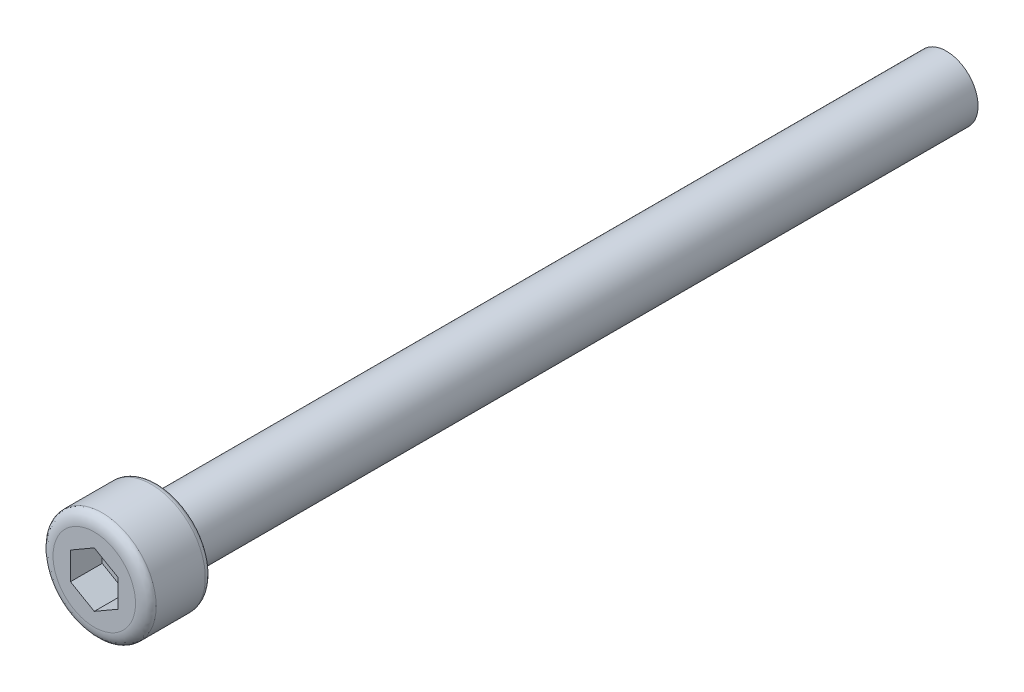
ISO-10303-21;
HEADER;
FILE_DESCRIPTION(('STEP AP214'),'2;1');
FILE_NAME('part.step','',(''),(''),'','','');
FILE_SCHEMA(('AUTOMOTIVE_DESIGN { 1 0 10303 214 1 1 1 1 }'));
ENDSEC;
DATA;
#1=APPLICATION_CONTEXT('core data for automotive mechanical design processes');
#2=APPLICATION_PROTOCOL_DEFINITION('international standard','automotive_design',2000,#1);
#3=PRODUCT_CONTEXT('',#1,'mechanical');
#4=PRODUCT('Part','Part','',(#3));
#5=PRODUCT_RELATED_PRODUCT_CATEGORY('part','',(#4));
#6=PRODUCT_DEFINITION_FORMATION('','',#4);
#7=PRODUCT_DEFINITION_CONTEXT('part definition',#1,'design');
#8=PRODUCT_DEFINITION('design','',#6,#7);
#9=PRODUCT_DEFINITION_SHAPE('','',#8);
#10=(LENGTH_UNIT() NAMED_UNIT(*) SI_UNIT(.MILLI.,.METRE.));
#11=(NAMED_UNIT(*) PLANE_ANGLE_UNIT() SI_UNIT($,.RADIAN.));
#12=(NAMED_UNIT(*) SI_UNIT($,.STERADIAN.) SOLID_ANGLE_UNIT());
#13=UNCERTAINTY_MEASURE_WITH_UNIT(LENGTH_MEASURE(1.E-05),#10,'distance_accuracy_value','');
#14=(GEOMETRIC_REPRESENTATION_CONTEXT(3) GLOBAL_UNCERTAINTY_ASSIGNED_CONTEXT((#13)) GLOBAL_UNIT_ASSIGNED_CONTEXT((#10,
#11,#12)) REPRESENTATION_CONTEXT('',''));
#15=CARTESIAN_POINT('',(0.,0.,0.));
#16=DIRECTION('',(0.,0.,1.));
#17=DIRECTION('',(1.,0.,0.));
#18=AXIS2_PLACEMENT_3D('',#15,#16,#17);
#19=CARTESIAN_POINT('',(0.,0.,27.));
#20=DIRECTION('',(0.,0.,1.));
#21=DIRECTION('',(1.,0.,0.));
#22=AXIS2_PLACEMENT_3D('',#19,#20,#21);
#23=PLANE('',#22);
#24=DIRECTION('',(-0.866025403784439,0.5,0.));
#25=VECTOR('',#24,1.);
#26=CARTESIAN_POINT('',(1.5,0.86602540378444,27.));
#27=LINE('',#26,#25);
#28=CARTESIAN_POINT('',(1.5,0.86602540378444,27.));
#29=VERTEX_POINT('',#28);
#30=CARTESIAN_POINT('',(0.,1.73205080756888,27.));
#31=VERTEX_POINT('',#30);
#32=EDGE_CURVE('E61',#29,#31,#27,.T.);
#33=ORIENTED_EDGE('',*,*,#32,.F.);
#34=DIRECTION('',(0.,1.,0.));
#35=VECTOR('',#34,1.);
#36=CARTESIAN_POINT('',(1.5,-0.866025403784439,27.));
#37=LINE('',#36,#35);
#38=CARTESIAN_POINT('',(1.5,-0.866025403784439,27.));
#39=VERTEX_POINT('',#38);
#40=EDGE_CURVE('E144',#39,#29,#37,.T.);
#41=ORIENTED_EDGE('',*,*,#40,.F.);
#42=DIRECTION('',(0.866025403784439,0.5,0.));
#43=VECTOR('',#42,1.);
#44=CARTESIAN_POINT('',(0.,-1.73205080756888,27.));
#45=LINE('',#44,#43);
#46=CARTESIAN_POINT('',(0.,-1.73205080756888,27.));
#47=VERTEX_POINT('',#46);
#48=EDGE_CURVE('E142',#47,#39,#45,.T.);
#49=ORIENTED_EDGE('',*,*,#48,.F.);
#50=DIRECTION('',(0.866025403784438,-0.5,0.));
#51=VECTOR('',#50,1.);
#52=CARTESIAN_POINT('',(-1.5,-0.866025403784438,27.));
#53=LINE('',#52,#51);
#54=CARTESIAN_POINT('',(-1.5,-0.866025403784438,27.));
#55=VERTEX_POINT('',#54);
#56=EDGE_CURVE('E109',#55,#47,#53,.T.);
#57=ORIENTED_EDGE('',*,*,#56,.F.);
#58=DIRECTION('',(0.,-1.,0.));
#59=VECTOR('',#58,1.);
#60=CARTESIAN_POINT('',(-1.5,0.866025403784439,27.));
#61=LINE('',#60,#59);
#62=CARTESIAN_POINT('',(-1.5,0.866025403784439,27.));
#63=VERTEX_POINT('',#62);
#64=EDGE_CURVE('E138',#63,#55,#61,.T.);
#65=ORIENTED_EDGE('',*,*,#64,.F.);
#66=DIRECTION('',(-0.866025403784439,-0.5,0.));
#67=VECTOR('',#66,1.);
#68=CARTESIAN_POINT('',(0.,1.73205080756888,27.));
#69=LINE('',#68,#67);
#70=EDGE_CURVE('E135',#31,#63,#69,.T.);
#71=ORIENTED_EDGE('',*,*,#70,.F.);
#72=EDGE_LOOP('',(#33,#41,#49,#57,#65,#71));
#73=FACE_BOUND('',#72,.T.);
#74=CARTESIAN_POINT('',(-2.6,0.,27.));
#75=CARTESIAN_POINT('',(-2.6,0.340339195747883,27.));
#76=CARTESIAN_POINT('',(-2.53232895612646,0.680544507086415,27.));
#77=CARTESIAN_POINT('',(-2.27184461293223,1.30940934121205,27.));
#78=CARTESIAN_POINT('',(-2.07913378430194,1.5978214778681,27.));
#79=CARTESIAN_POINT('',(-1.59782147786811,2.07913378430193,27.));
#80=CARTESIAN_POINT('',(-1.30940934121206,2.27184461293215,27.));
#81=CARTESIAN_POINT('',(-0.680544507086416,2.53232895612653,27.));
#82=CARTESIAN_POINT('',(-0.340339195747889,2.6,27.));
#83=CARTESIAN_POINT('',(0.340339195747889,2.6,27.));
#84=CARTESIAN_POINT('',(0.680544507086414,2.53232895612653,27.));
#85=CARTESIAN_POINT('',(1.30940934121205,2.27184461293216,27.));
#86=CARTESIAN_POINT('',(1.5978214778681,2.07913378430191,27.));
#87=CARTESIAN_POINT('',(2.07913378430195,1.59782147786813,27.));
#88=CARTESIAN_POINT('',(2.27184461293222,1.30940934121206,27.));
#89=CARTESIAN_POINT('',(2.53232895612648,0.6805445070864,27.));
#90=CARTESIAN_POINT('',(2.6,0.340339195748109,27.));
#91=CARTESIAN_POINT('',(2.6,-0.340339195748121,27.));
#92=CARTESIAN_POINT('',(2.5323289561267,-0.680544507086153,27.));
#93=CARTESIAN_POINT('',(2.27184461293199,-1.30940934121233,27.));
#94=CARTESIAN_POINT('',(2.0791337843018,-1.59782147786829,27.));
#95=CARTESIAN_POINT('',(1.59782147786825,-2.07913378430177,27.));
#96=CARTESIAN_POINT('',(1.30940934121224,-2.27184461293217,27.));
#97=CARTESIAN_POINT('',(0.680544507086231,-2.53232895612654,27.));
#98=CARTESIAN_POINT('',(0.340339195748087,-2.60000000000001,27.));
#99=CARTESIAN_POINT('',(-0.340339195748083,-2.60000000000001,27.));
#100=CARTESIAN_POINT('',(-0.680544507086234,-2.53232895612669,27.));
#101=CARTESIAN_POINT('',(-1.30940934121224,-2.27184461293202,27.));
#102=CARTESIAN_POINT('',(-1.59782147786815,-2.07913378430195,27.));
#103=CARTESIAN_POINT('',(-2.0791337843019,-1.59782147786812,27.));
#104=CARTESIAN_POINT('',(-2.27184461293216,-1.30940934121205,27.));
#105=CARTESIAN_POINT('',(-2.53232895612654,-0.68054450708642,27.));
#106=CARTESIAN_POINT('',(-2.6,-0.340339195747894,27.));
#107=CARTESIAN_POINT('',(-2.6,0.,27.));
#108=(BOUNDED_CURVE() B_SPLINE_CURVE(3,(#74,#75,#76,#77,#78,#79,#80,#81,#82,#83,#84,#85,#86,#87,
#88,#89,#90,#91,#92,#93,#94,#95,#96,#97,#98,#99,#100,#101,#102,#103,#104,#105,#106,#107),
.UNSPECIFIED.,.T.,.F.) B_SPLINE_CURVE_WITH_KNOTS((4,2,2,2,2,2,2,2,2,2,2,2,2,2,2,2,4),
(-3.14159265358979,-2.74889357189107,-2.35619449019234,-1.96349540849362,-1.5707963267949,
-1.17809724509617,-0.785398163397448,-0.392699081698724,0.,0.392699081698724,0.785398163397448,
1.17809724509617,1.5707963267949,1.96349540849362,2.35619449019234,2.74889357189107,
3.14159265358979),
.UNSPECIFIED.) CURVE() GEOMETRIC_REPRESENTATION_ITEM() RATIONAL_B_SPLINE_CURVE((1.,1.,1.,1.,1.,
1.,1.,1.,1.,1.,1.,1.,1.,1.,1.,1.,1.,1.,1.,1.,1.,1.,1.,1.,1.,1.,1.,1.,1.,1.,1.,1.,1.,1.)) REPRESENTATION_ITEM(''));
#109=CARTESIAN_POINT('',(-2.6,0.,27.));
#110=VERTEX_POINT('',#109);
#111=EDGE_CURVE('E12',#110,#110,#108,.F.);
#112=ORIENTED_EDGE('',*,*,#111,.T.);
#113=EDGE_LOOP('',(#112));
#114=FACE_BOUND('',#113,.T.);
#115=ADVANCED_FACE('F40',(#73,#114),#23,.T.);
#116=CARTESIAN_POINT('',(0.,0.,-27.));
#117=DIRECTION('',(0.,0.,-1.));
#118=DIRECTION('',(-1.,0.,0.));
#119=AXIS2_PLACEMENT_3D('',#116,#117,#118);
#120=CYLINDRICAL_SURFACE('',#119,3.4);
#121=CARTESIAN_POINT('',(-3.4,0.,26.5));
#122=CARTESIAN_POINT('',(-3.4,-0.445058948285706,26.5));
#123=CARTESIAN_POINT('',(-3.31150709647315,-0.889942816959149,26.5));
#124=CARTESIAN_POINT('',(-2.97087372460361,-1.71230452312347,26.5));
#125=CARTESIAN_POINT('',(-2.71886725639482,-2.08945885567371,26.5));
#126=CARTESIAN_POINT('',(-2.0894588556737,-2.71886725639483,26.5));
#127=CARTESIAN_POINT('',(-1.71230452312375,-2.9708737246035,26.5));
#128=CARTESIAN_POINT('',(-0.889942816958871,-3.31150709647327,26.5));
#129=CARTESIAN_POINT('',(-0.445058948285955,-3.40000000000001,26.5));
#130=CARTESIAN_POINT('',(0.44505894828596,-3.40000000000001,26.5));
#131=CARTESIAN_POINT('',(0.889942816958919,-3.31150709647325,26.5));
#132=CARTESIAN_POINT('',(1.7123045231237,-2.97087372460352,26.5));
#133=CARTESIAN_POINT('',(2.08945885567389,-2.71886725639465,26.5));
#134=CARTESIAN_POINT('',(2.71886725639464,-2.08945885567389,26.5));
#135=CARTESIAN_POINT('',(2.97087372460347,-1.71230452312381,26.5));
#136=CARTESIAN_POINT('',(3.31150709647329,-0.889942816958812,26.5));
#137=CARTESIAN_POINT('',(3.4,-0.445058948286002,26.5));
#138=CARTESIAN_POINT('',(3.4,0.44505894828599,26.5));
#139=CARTESIAN_POINT('',(3.31150709647315,0.889942816959131,26.5));
#140=CARTESIAN_POINT('',(2.9708737246036,1.71230452312347,26.5));
#141=CARTESIAN_POINT('',(2.71886725639483,2.0894588556737,26.5));
#142=CARTESIAN_POINT('',(2.0894588556737,2.71886725639482,26.5));
#143=CARTESIAN_POINT('',(1.71230452312345,2.97087372460361,26.5));
#144=CARTESIAN_POINT('',(0.889942816959163,3.31150709647313,26.5));
#145=CARTESIAN_POINT('',(0.445058948285701,3.4,26.5));
#146=CARTESIAN_POINT('',(-0.4450589482857,3.4,26.5));
#147=CARTESIAN_POINT('',(-0.88994281695914,3.31150709647314,26.5));
#148=CARTESIAN_POINT('',(-1.71230452312348,2.9708737246036,26.5));
#149=CARTESIAN_POINT('',(-2.08945885567371,2.71886725639482,26.5));
#150=CARTESIAN_POINT('',(-2.71886725639482,2.0894588556737,26.5));
#151=CARTESIAN_POINT('',(-2.97087372460362,1.71230452312344,26.5));
#152=CARTESIAN_POINT('',(-3.31150709647313,0.889942816959173,26.5));
#153=CARTESIAN_POINT('',(-3.4,0.445058948285695,26.5));
#154=CARTESIAN_POINT('',(-3.4,0.,26.5));
#155=(BOUNDED_CURVE() B_SPLINE_CURVE(3,(#121,#122,#123,#124,#125,#126,#127,#128,#129,#130,#131,
#132,#133,#134,#135,#136,#137,#138,#139,#140,#141,#142,#143,#144,#145,#146,#147,#148,#149,#150,
#151,#152,#153,#154),.UNSPECIFIED.,.T.,.F.) B_SPLINE_CURVE_WITH_KNOTS((4,2,2,2,2,2,2,2,2,2,2,2,
2,2,2,2,4),(-3.14159265358979,-2.74889357189107,-2.35619449019234,-1.96349540849362,
-1.5707963267949,-1.17809724509617,-0.785398163397448,-0.392699081698724,0.,0.392699081698724,
0.785398163397448,1.17809724509617,1.5707963267949,1.96349540849362,2.35619449019234,
2.74889357189107,3.14159265358979),
.UNSPECIFIED.) CURVE() GEOMETRIC_REPRESENTATION_ITEM() RATIONAL_B_SPLINE_CURVE((1.,1.,1.,1.,1.,
1.,1.,1.,1.,1.,1.,1.,1.,1.,1.,1.,1.,1.,1.,1.,1.,1.,1.,1.,1.,1.,1.,1.,1.,1.,1.,1.,1.,1.)) REPRESENTATION_ITEM(''));
#156=CARTESIAN_POINT('',(-3.4,0.,26.5));
#157=VERTEX_POINT('',#156);
#158=EDGE_CURVE('E54',#157,#157,#155,.F.);
#159=ORIENTED_EDGE('',*,*,#158,.T.);
#160=EDGE_LOOP('',(#159));
#161=FACE_BOUND('',#160,.T.);
#162=CARTESIAN_POINT('',(0.,0.,23.4));
#163=DIRECTION('',(0.,0.,-1.));
#164=DIRECTION('',(-1.,0.,0.));
#165=AXIS2_PLACEMENT_3D('',#162,#163,#164);
#166=CIRCLE('',#165,3.4);
#167=CARTESIAN_POINT('',(-3.4,0.,23.4));
#168=VERTEX_POINT('',#167);
#169=EDGE_CURVE('E165',#168,#168,#166,.F.);
#170=ORIENTED_EDGE('',*,*,#169,.T.);
#171=EDGE_LOOP('',(#170));
#172=FACE_BOUND('',#171,.T.);
#173=ADVANCED_FACE('F177',(#161,#172),#120,.T.);
#174=CARTESIAN_POINT('',(0.,3.4,23.));
#175=DIRECTION('',(0.,0.,-1.));
#176=DIRECTION('',(-1.,0.,0.));
#177=AXIS2_PLACEMENT_3D('',#174,#175,#176);
#178=PLANE('',#177);
#179=CARTESIAN_POINT('',(0.,0.,23.));
#180=DIRECTION('',(0.,0.,-1.));
#181=DIRECTION('',(-1.,0.,0.));
#182=AXIS2_PLACEMENT_3D('',#179,#180,#181);
#183=CIRCLE('',#182,3.);
#184=CARTESIAN_POINT('',(-3.,0.,23.));
#185=VERTEX_POINT('',#184);
#186=EDGE_CURVE('E162',#185,#185,#183,.T.);
#187=ORIENTED_EDGE('',*,*,#186,.T.);
#188=EDGE_LOOP('',(#187));
#189=FACE_BOUND('',#188,.T.);
#190=CARTESIAN_POINT('',(0.,0.,23.));
#191=DIRECTION('',(0.,0.,-1.));
#192=DIRECTION('',(-1.,0.,0.));
#193=AXIS2_PLACEMENT_3D('',#190,#191,#192);
#194=CIRCLE('',#193,2.00000000000001);
#195=CARTESIAN_POINT('',(-2.00000000000001,0.,23.));
#196=VERTEX_POINT('',#195);
#197=EDGE_CURVE('E148',#196,#196,#194,.T.);
#198=ORIENTED_EDGE('',*,*,#197,.F.);
#199=EDGE_LOOP('',(#198));
#200=FACE_BOUND('',#199,.T.);
#201=ADVANCED_FACE('F187',(#189,#200),#178,.T.);
#202=CARTESIAN_POINT('',(0.,0.,-27.));
#203=DIRECTION('',(0.,0.,-1.));
#204=DIRECTION('',(-1.,0.,0.));
#205=AXIS2_PLACEMENT_3D('',#202,#203,#204);
#206=CYLINDRICAL_SURFACE('',#205,2.00000000000001);
#207=CARTESIAN_POINT('',(0.,0.,-26.7));
#208=DIRECTION('',(0.,0.,-1.));
#209=DIRECTION('',(-1.,0.,0.));
#210=AXIS2_PLACEMENT_3D('',#207,#208,#209);
#211=CIRCLE('',#210,2.00000000000001);
#212=CARTESIAN_POINT('',(-2.00000000000001,0.,-26.7));
#213=VERTEX_POINT('',#212);
#214=EDGE_CURVE('E159',#213,#213,#211,.F.);
#215=ORIENTED_EDGE('',*,*,#214,.T.);
#216=EDGE_LOOP('',(#215));
#217=FACE_BOUND('',#216,.T.);
#218=ORIENTED_EDGE('',*,*,#197,.T.);
#219=EDGE_LOOP('',(#218));
#220=FACE_BOUND('',#219,.T.);
#221=ADVANCED_FACE('F236',(#217,#220),#206,.T.);
#222=CARTESIAN_POINT('',(0.,2.,-27.));
#223=DIRECTION('',(0.,0.,-1.));
#224=DIRECTION('',(-1.,0.,0.));
#225=AXIS2_PLACEMENT_3D('',#222,#223,#224);
#226=PLANE('',#225);
#227=CARTESIAN_POINT('',(0.,0.,-27.));
#228=DIRECTION('',(0.,0.,-1.));
#229=DIRECTION('',(-1.,0.,0.));
#230=AXIS2_PLACEMENT_3D('',#227,#228,#229);
#231=CIRCLE('',#230,1.48038475772933);
#232=CARTESIAN_POINT('',(-1.48038475772933,0.,-27.));
#233=VERTEX_POINT('',#232);
#234=EDGE_CURVE('E156',#233,#233,#231,.T.);
#235=ORIENTED_EDGE('',*,*,#234,.T.);
#236=EDGE_LOOP('',(#235));
#237=FACE_BOUND('',#236,.T.);
#238=ADVANCED_FACE('F228',(#237),#226,.T.);
#239=CARTESIAN_POINT('',(0.,0.,-27.));
#240=DIRECTION('',(0.,0.,1.));
#241=DIRECTION('',(1.,0.,0.));
#242=AXIS2_PLACEMENT_3D('',#239,#240,#241);
#243=CONICAL_SURFACE('',#242,1.48038475772933,1.0471975511966);
#244=ORIENTED_EDGE('',*,*,#214,.F.);
#245=EDGE_LOOP('',(#244));
#246=FACE_BOUND('',#245,.T.);
#247=ORIENTED_EDGE('',*,*,#234,.F.);
#248=EDGE_LOOP('',(#247));
#249=FACE_BOUND('',#248,.T.);
#250=ADVANCED_FACE('F194',(#246,#249),#243,.T.);
#251=CARTESIAN_POINT('',(0.,0.,23.4));
#252=DIRECTION('',(0.,0.,-1.));
#253=DIRECTION('',(-1.,0.,0.));
#254=AXIS2_PLACEMENT_3D('',#251,#252,#253);
#255=TOROIDAL_SURFACE('',#254,3.,0.4);
#256=ORIENTED_EDGE('',*,*,#169,.F.);
#257=EDGE_LOOP('',(#256));
#258=FACE_BOUND('',#257,.T.);
#259=ORIENTED_EDGE('',*,*,#186,.F.);
#260=EDGE_LOOP('',(#259));
#261=FACE_BOUND('',#260,.T.);
#262=ADVANCED_FACE('F217',(#258,#261),#255,.T.);
#263=CARTESIAN_POINT('',(-2.6,0.,27.));
#264=CARTESIAN_POINT('',(-2.6,-0.340339195747894,27.));
#265=CARTESIAN_POINT('',(-2.53232895612654,-0.68054450708642,27.));
#266=CARTESIAN_POINT('',(-2.27184461293216,-1.30940934121205,27.));
#267=CARTESIAN_POINT('',(-2.0791337843019,-1.59782147786812,27.));
#268=CARTESIAN_POINT('',(-1.59782147786815,-2.07913378430195,27.));
#269=CARTESIAN_POINT('',(-1.30940934121224,-2.27184461293202,27.));
#270=CARTESIAN_POINT('',(-0.680544507086234,-2.53232895612669,27.));
#271=CARTESIAN_POINT('',(-0.340339195748083,-2.60000000000001,27.));
#272=CARTESIAN_POINT('',(0.340339195748087,-2.60000000000001,27.));
#273=CARTESIAN_POINT('',(0.680544507086231,-2.53232895612654,27.));
#274=CARTESIAN_POINT('',(1.30940934121224,-2.27184461293217,27.));
#275=CARTESIAN_POINT('',(1.59782147786825,-2.07913378430177,27.));
#276=CARTESIAN_POINT('',(2.0791337843018,-1.59782147786829,27.));
#277=CARTESIAN_POINT('',(2.27184461293199,-1.30940934121233,27.));
#278=CARTESIAN_POINT('',(2.5323289561267,-0.680544507086153,27.));
#279=CARTESIAN_POINT('',(2.6,-0.340339195748121,27.));
#280=CARTESIAN_POINT('',(2.6,0.340339195748109,27.));
#281=CARTESIAN_POINT('',(2.53232895612648,0.6805445070864,27.));
#282=CARTESIAN_POINT('',(2.27184461293222,1.30940934121206,27.));
#283=CARTESIAN_POINT('',(2.07913378430195,1.59782147786813,27.));
#284=CARTESIAN_POINT('',(1.5978214778681,2.07913378430191,27.));
#285=CARTESIAN_POINT('',(1.30940934121205,2.27184461293216,27.));
#286=CARTESIAN_POINT('',(0.680544507086414,2.53232895612653,27.));
#287=CARTESIAN_POINT('',(0.340339195747889,2.6,27.));
#288=CARTESIAN_POINT('',(-0.340339195747889,2.6,27.));
#289=CARTESIAN_POINT('',(-0.680544507086416,2.53232895612653,27.));
#290=CARTESIAN_POINT('',(-1.30940934121206,2.27184461293215,27.));
#291=CARTESIAN_POINT('',(-1.59782147786811,2.07913378430193,27.));
#292=CARTESIAN_POINT('',(-2.07913378430194,1.5978214778681,27.));
#293=CARTESIAN_POINT('',(-2.27184461293223,1.30940934121205,27.));
#294=CARTESIAN_POINT('',(-2.53232895612646,0.680544507086415,27.));
#295=CARTESIAN_POINT('',(-2.6,0.340339195747883,27.));
#296=CARTESIAN_POINT('',(-2.6,0.,27.));
#297=CARTESIAN_POINT('',(-3.4,0.,27.));
#298=CARTESIAN_POINT('',(-3.4,-0.445058948285706,27.));
#299=CARTESIAN_POINT('',(-3.31150709647319,-0.889942816959165,27.));
#300=CARTESIAN_POINT('',(-2.97087372460357,-1.71230452312345,27.));
#301=CARTESIAN_POINT('',(-2.71886725639478,-2.08945885567368,27.));
#302=CARTESIAN_POINT('',(-2.08945885567374,-2.71886725639487,27.));
#303=CARTESIAN_POINT('',(-1.71230452312373,-2.97087372460345,27.));
#304=CARTESIAN_POINT('',(-0.88994281695889,-3.31150709647331,27.));
#305=CARTESIAN_POINT('',(-0.445058948285955,-3.40000000000001,27.));
#306=CARTESIAN_POINT('',(0.44505894828596,-3.40000000000001,27.));
#307=CARTESIAN_POINT('',(0.889942816958886,-3.31150709647317,27.));
#308=CARTESIAN_POINT('',(1.71230452312373,-2.9708737246036,27.));
#309=CARTESIAN_POINT('',(2.08945885567385,-2.71886725639461,27.));
#310=CARTESIAN_POINT('',(2.71886725639468,-2.08945885567393,27.));
#311=CARTESIAN_POINT('',(2.97087372460342,-1.71230452312379,27.));
#312=CARTESIAN_POINT('',(3.31150709647333,-0.889942816958831,27.));
#313=CARTESIAN_POINT('',(3.4,-0.445058948286002,27.));
#314=CARTESIAN_POINT('',(3.4,0.44505894828599,27.));
#315=CARTESIAN_POINT('',(3.31150709647311,0.889942816959115,27.));
#316=CARTESIAN_POINT('',(2.97087372460364,1.71230452312349,27.));
#317=CARTESIAN_POINT('',(2.71886725639483,2.08945885567362,27.));
#318=CARTESIAN_POINT('',(2.0894588556737,2.71886725639489,27.));
#319=CARTESIAN_POINT('',(1.71230452312347,2.97087372460366,27.));
#320=CARTESIAN_POINT('',(0.889942816959142,3.31150709647308,27.));
#321=CARTESIAN_POINT('',(0.445058948285701,3.4,27.));
#322=CARTESIAN_POINT('',(-0.4450589482857,3.4,27.));
#323=CARTESIAN_POINT('',(-0.889942816959144,3.31150709647315,27.));
#324=CARTESIAN_POINT('',(-1.71230452312347,2.97087372460359,27.));
#325=CARTESIAN_POINT('',(-2.08945885567374,2.71886725639485,27.));
#326=CARTESIAN_POINT('',(-2.71886725639479,2.08945885567366,27.));
#327=CARTESIAN_POINT('',(-2.97087372460364,1.71230452312345,27.));
#328=CARTESIAN_POINT('',(-3.31150709647311,0.889942816959163,27.));
#329=CARTESIAN_POINT('',(-3.4,0.445058948285695,27.));
#330=CARTESIAN_POINT('',(-3.4,0.,27.));
#331=CARTESIAN_POINT('',(-3.4,0.,26.5));
#332=CARTESIAN_POINT('',(-3.4,-0.445058948285706,26.5));
#333=CARTESIAN_POINT('',(-3.31150709647315,-0.889942816959149,26.5));
#334=CARTESIAN_POINT('',(-2.97087372460361,-1.71230452312347,26.5));
#335=CARTESIAN_POINT('',(-2.71886725639482,-2.08945885567371,26.5));
#336=CARTESIAN_POINT('',(-2.0894588556737,-2.71886725639483,26.5));
#337=CARTESIAN_POINT('',(-1.71230452312375,-2.9708737246035,26.5));
#338=CARTESIAN_POINT('',(-0.889942816958871,-3.31150709647327,26.5));
#339=CARTESIAN_POINT('',(-0.445058948285955,-3.40000000000001,26.5));
#340=CARTESIAN_POINT('',(0.44505894828596,-3.40000000000001,26.5));
#341=CARTESIAN_POINT('',(0.889942816958919,-3.31150709647325,26.5));
#342=CARTESIAN_POINT('',(1.7123045231237,-2.97087372460352,26.5));
#343=CARTESIAN_POINT('',(2.08945885567389,-2.71886725639465,26.5));
#344=CARTESIAN_POINT('',(2.71886725639464,-2.08945885567389,26.5));
#345=CARTESIAN_POINT('',(2.97087372460347,-1.71230452312381,26.5));
#346=CARTESIAN_POINT('',(3.31150709647329,-0.889942816958812,26.5));
#347=CARTESIAN_POINT('',(3.4,-0.445058948286002,26.5));
#348=CARTESIAN_POINT('',(3.4,0.44505894828599,26.5));
#349=CARTESIAN_POINT('',(3.31150709647315,0.889942816959131,26.5));
#350=CARTESIAN_POINT('',(2.9708737246036,1.71230452312347,26.5));
#351=CARTESIAN_POINT('',(2.71886725639483,2.0894588556737,26.5));
#352=CARTESIAN_POINT('',(2.0894588556737,2.71886725639482,26.5));
#353=CARTESIAN_POINT('',(1.71230452312345,2.97087372460361,26.5));
#354=CARTESIAN_POINT('',(0.889942816959163,3.31150709647313,26.5));
#355=CARTESIAN_POINT('',(0.445058948285701,3.4,26.5));
#356=CARTESIAN_POINT('',(-0.4450589482857,3.4,26.5));
#357=CARTESIAN_POINT('',(-0.88994281695914,3.31150709647314,26.5));
#358=CARTESIAN_POINT('',(-1.71230452312348,2.9708737246036,26.5));
#359=CARTESIAN_POINT('',(-2.08945885567371,2.71886725639482,26.5));
#360=CARTESIAN_POINT('',(-2.71886725639482,2.0894588556737,26.5));
#361=CARTESIAN_POINT('',(-2.97087372460362,1.71230452312344,26.5));
#362=CARTESIAN_POINT('',(-3.31150709647313,0.889942816959173,26.5));
#363=CARTESIAN_POINT('',(-3.4,0.445058948285695,26.5));
#364=CARTESIAN_POINT('',(-3.4,0.,26.5));
#365=(BOUNDED_SURFACE() B_SPLINE_SURFACE(2,3,((#263,#264,#265,#266,#267,#268,#269,#270,#271,
#272,#273,#274,#275,#276,#277,#278,#279,#280,#281,#282,#283,#284,#285,#286,#287,#288,#289,#290,
#291,#292,#293,#294,#295,#296),(#297,#298,#299,#300,#301,#302,#303,#304,#305,#306,#307,#308,
#309,#310,#311,#312,#313,#314,#315,#316,#317,#318,#319,#320,#321,#322,#323,#324,#325,#326,#327,
#328,#329,#330),(#331,#332,#333,#334,#335,#336,#337,#338,#339,#340,#341,#342,#343,#344,#345,
#346,#347,#348,#349,#350,#351,#352,#353,#354,#355,#356,#357,#358,#359,#360,#361,#362,#363,
#364)),.UNSPECIFIED.,.F.,.T.,.F.) B_SPLINE_SURFACE_WITH_KNOTS((3,3),(4,2,2,2,2,2,2,2,2,2,2,2,2,
2,2,2,4),(0.,1.),(-3.14159265358979,-2.74889357189107,-2.35619449019234,-1.96349540849362,
-1.5707963267949,-1.17809724509617,-0.785398163397448,-0.392699081698724,0.,0.392699081698724,
0.785398163397448,1.17809724509617,1.5707963267949,1.96349540849362,2.35619449019234,
2.74889357189107,3.14159265358979),
.UNSPECIFIED.) GEOMETRIC_REPRESENTATION_ITEM() RATIONAL_B_SPLINE_SURFACE(((1.,1.,1.,1.,1.,1.,1.,
1.,1.,1.,1.,1.,1.,1.,1.,1.,1.,1.,1.,1.,1.,1.,1.,1.,1.,1.,1.,1.,1.,1.,1.,1.,1.,1.),
(0.707106781186548,0.707106781186548,0.707106781186548,0.707106781186548,0.707106781186548,
0.707106781186548,0.707106781186548,0.707106781186548,0.707106781186548,0.707106781186548,
0.707106781186548,0.707106781186548,0.707106781186548,0.707106781186548,0.707106781186548,
0.707106781186548,0.707106781186548,0.707106781186548,0.707106781186548,0.707106781186548,
0.707106781186548,0.707106781186548,0.707106781186548,0.707106781186548,0.707106781186548,
0.707106781186548,0.707106781186548,0.707106781186548,0.707106781186548,0.707106781186548,
0.707106781186548,0.707106781186548,0.707106781186548,0.707106781186548),(1.,1.,1.,1.,1.,1.,1.,
1.,1.,1.,1.,1.,1.,1.,1.,1.,1.,1.,1.,1.,1.,1.,1.,1.,1.,1.,1.,1.,1.,1.,1.,1.,1.,1.))) REPRESENTATION_ITEM('') SURFACE());
#366=ORIENTED_EDGE('',*,*,#111,.F.);
#367=EDGE_LOOP('',(#366));
#368=FACE_BOUND('',#367,.T.);
#369=ORIENTED_EDGE('',*,*,#158,.F.);
#370=EDGE_LOOP('',(#369));
#371=FACE_BOUND('',#370,.T.);
#372=ADVANCED_FACE('F43',(#368,#371),#365,.T.);
#373=CARTESIAN_POINT('',(1.5,0.86602540378444,25.));
#374=DIRECTION('',(0.5,0.866025403784439,0.));
#375=DIRECTION('',(-0.866025403784439,0.5,0.));
#376=AXIS2_PLACEMENT_3D('',#373,#374,#375);
#377=PLANE('',#376);
#378=ORIENTED_EDGE('',*,*,#32,.T.);
#379=DIRECTION('',(0.,0.,1.));
#380=VECTOR('',#379,1.);
#381=CARTESIAN_POINT('',(0.,1.73205080756888,25.));
#382=LINE('',#381,#380);
#383=CARTESIAN_POINT('',(0.,1.73205080756888,25.));
#384=VERTEX_POINT('',#383);
#385=EDGE_CURVE('E91',#384,#31,#382,.T.);
#386=ORIENTED_EDGE('',*,*,#385,.F.);
#387=DIRECTION('',(-0.866025403784439,0.5,0.));
#388=VECTOR('',#387,1.);
#389=CARTESIAN_POINT('',(1.5,0.86602540378444,25.));
#390=LINE('',#389,#388);
#391=CARTESIAN_POINT('',(1.5,0.86602540378444,25.));
#392=VERTEX_POINT('',#391);
#393=EDGE_CURVE('E146',#392,#384,#390,.T.);
#394=ORIENTED_EDGE('',*,*,#393,.F.);
#395=DIRECTION('',(0.,0.,1.));
#396=VECTOR('',#395,1.);
#397=CARTESIAN_POINT('',(1.5,0.86602540378444,25.));
#398=LINE('',#397,#396);
#399=EDGE_CURVE('E69',#392,#29,#398,.T.);
#400=ORIENTED_EDGE('',*,*,#399,.T.);
#401=EDGE_LOOP('',(#378,#386,#394,#400));
#402=FACE_BOUND('',#401,.T.);
#403=ADVANCED_FACE('F216',(#402),#377,.F.);
#404=CARTESIAN_POINT('',(1.5,-0.866025403784439,25.));
#405=DIRECTION('',(1.,0.,0.));
#406=DIRECTION('',(0.,0.,-1.));
#407=AXIS2_PLACEMENT_3D('',#404,#405,#406);
#408=PLANE('',#407);
#409=ORIENTED_EDGE('',*,*,#40,.T.);
#410=ORIENTED_EDGE('',*,*,#399,.F.);
#411=DIRECTION('',(0.,1.,0.));
#412=VECTOR('',#411,1.);
#413=CARTESIAN_POINT('',(1.5,-0.866025403784439,25.));
#414=LINE('',#413,#412);
#415=CARTESIAN_POINT('',(1.5,-0.866025403784439,25.));
#416=VERTEX_POINT('',#415);
#417=EDGE_CURVE('E121',#416,#392,#414,.T.);
#418=ORIENTED_EDGE('',*,*,#417,.F.);
#419=DIRECTION('',(0.,0.,1.));
#420=VECTOR('',#419,1.);
#421=CARTESIAN_POINT('',(1.5,-0.866025403784439,25.));
#422=LINE('',#421,#420);
#423=EDGE_CURVE('E113',#416,#39,#422,.T.);
#424=ORIENTED_EDGE('',*,*,#423,.T.);
#425=EDGE_LOOP('',(#409,#410,#418,#424));
#426=FACE_BOUND('',#425,.T.);
#427=ADVANCED_FACE('F222',(#426),#408,.F.);
#428=CARTESIAN_POINT('',(0.,-1.73205080756888,25.));
#429=DIRECTION('',(0.5,-0.866025403784439,0.));
#430=DIRECTION('',(0.866025403784439,0.5,0.));
#431=AXIS2_PLACEMENT_3D('',#428,#429,#430);
#432=PLANE('',#431);
#433=ORIENTED_EDGE('',*,*,#48,.T.);
#434=ORIENTED_EDGE('',*,*,#423,.F.);
#435=DIRECTION('',(0.866025403784439,0.5,0.));
#436=VECTOR('',#435,1.);
#437=CARTESIAN_POINT('',(0.,-1.73205080756888,25.));
#438=LINE('',#437,#436);
#439=CARTESIAN_POINT('',(0.,-1.73205080756888,25.));
#440=VERTEX_POINT('',#439);
#441=EDGE_CURVE('E117',#440,#416,#438,.T.);
#442=ORIENTED_EDGE('',*,*,#441,.F.);
#443=DIRECTION('',(0.,0.,1.));
#444=VECTOR('',#443,1.);
#445=CARTESIAN_POINT('',(0.,-1.73205080756888,25.));
#446=LINE('',#445,#444);
#447=EDGE_CURVE('E102',#440,#47,#446,.T.);
#448=ORIENTED_EDGE('',*,*,#447,.T.);
#449=EDGE_LOOP('',(#433,#434,#442,#448));
#450=FACE_BOUND('',#449,.T.);
#451=ADVANCED_FACE('F118',(#450),#432,.F.);
#452=CARTESIAN_POINT('',(-1.5,-0.866025403784438,25.));
#453=DIRECTION('',(-0.5,-0.866025403784439,0.));
#454=DIRECTION('',(0.866025403784439,-0.5,0.));
#455=AXIS2_PLACEMENT_3D('',#452,#453,#454);
#456=PLANE('',#455);
#457=ORIENTED_EDGE('',*,*,#56,.T.);
#458=ORIENTED_EDGE('',*,*,#447,.F.);
#459=DIRECTION('',(0.866025403784438,-0.5,0.));
#460=VECTOR('',#459,1.);
#461=CARTESIAN_POINT('',(-1.5,-0.866025403784438,25.));
#462=LINE('',#461,#460);
#463=CARTESIAN_POINT('',(-1.5,-0.866025403784438,25.));
#464=VERTEX_POINT('',#463);
#465=EDGE_CURVE('E106',#464,#440,#462,.T.);
#466=ORIENTED_EDGE('',*,*,#465,.F.);
#467=DIRECTION('',(0.,0.,1.));
#468=VECTOR('',#467,1.);
#469=CARTESIAN_POINT('',(-1.5,-0.866025403784438,25.));
#470=LINE('',#469,#468);
#471=EDGE_CURVE('E114',#464,#55,#470,.T.);
#472=ORIENTED_EDGE('',*,*,#471,.T.);
#473=EDGE_LOOP('',(#457,#458,#466,#472));
#474=FACE_BOUND('',#473,.T.);
#475=ADVANCED_FACE('F104',(#474),#456,.F.);
#476=CARTESIAN_POINT('',(-1.5,0.866025403784439,25.));
#477=DIRECTION('',(-1.,0.,0.));
#478=DIRECTION('',(0.,0.,1.));
#479=AXIS2_PLACEMENT_3D('',#476,#477,#478);
#480=PLANE('',#479);
#481=ORIENTED_EDGE('',*,*,#64,.T.);
#482=ORIENTED_EDGE('',*,*,#471,.F.);
#483=DIRECTION('',(0.,-1.,0.));
#484=VECTOR('',#483,1.);
#485=CARTESIAN_POINT('',(-1.5,0.866025403784439,25.));
#486=LINE('',#485,#484);
#487=CARTESIAN_POINT('',(-1.5,0.866025403784439,25.));
#488=VERTEX_POINT('',#487);
#489=EDGE_CURVE('E127',#488,#464,#486,.T.);
#490=ORIENTED_EDGE('',*,*,#489,.F.);
#491=DIRECTION('',(0.,0.,1.));
#492=VECTOR('',#491,1.);
#493=CARTESIAN_POINT('',(-1.5,0.866025403784439,25.));
#494=LINE('',#493,#492);
#495=EDGE_CURVE('E151',#488,#63,#494,.T.);
#496=ORIENTED_EDGE('',*,*,#495,.T.);
#497=EDGE_LOOP('',(#481,#482,#490,#496));
#498=FACE_BOUND('',#497,.T.);
#499=ADVANCED_FACE('F250',(#498),#480,.F.);
#500=CARTESIAN_POINT('',(0.,1.73205080756888,25.));
#501=DIRECTION('',(-0.5,0.866025403784439,0.));
#502=DIRECTION('',(-0.866025403784439,-0.5,0.));
#503=AXIS2_PLACEMENT_3D('',#500,#501,#502);
#504=PLANE('',#503);
#505=ORIENTED_EDGE('',*,*,#70,.T.);
#506=ORIENTED_EDGE('',*,*,#495,.F.);
#507=DIRECTION('',(-0.866025403784439,-0.5,0.));
#508=VECTOR('',#507,1.);
#509=CARTESIAN_POINT('',(0.,1.73205080756888,25.));
#510=LINE('',#509,#508);
#511=EDGE_CURVE('E129',#384,#488,#510,.T.);
#512=ORIENTED_EDGE('',*,*,#511,.F.);
#513=ORIENTED_EDGE('',*,*,#385,.T.);
#514=EDGE_LOOP('',(#505,#506,#512,#513));
#515=FACE_BOUND('',#514,.T.);
#516=ADVANCED_FACE('F247',(#515),#504,.F.);
#517=CARTESIAN_POINT('',(0.,0.,25.));
#518=DIRECTION('',(0.,0.,1.));
#519=DIRECTION('',(1.,0.,0.));
#520=AXIS2_PLACEMENT_3D('',#517,#518,#519);
#521=PLANE('',#520);
#522=ORIENTED_EDGE('',*,*,#393,.T.);
#523=ORIENTED_EDGE('',*,*,#511,.T.);
#524=ORIENTED_EDGE('',*,*,#489,.T.);
#525=ORIENTED_EDGE('',*,*,#465,.T.);
#526=ORIENTED_EDGE('',*,*,#441,.T.);
#527=ORIENTED_EDGE('',*,*,#417,.T.);
#528=EDGE_LOOP('',(#522,#523,#524,#525,#526,#527));
#529=FACE_BOUND('',#528,.T.);
#530=ADVANCED_FACE('F124',(#529),#521,.T.);
#531=CLOSED_SHELL('',(#115,#173,#201,#221,#238,#250,#262,#372,#403,#427,#451,#475,#499,#516,#530));
#532=MANIFOLD_SOLID_BREP('B2',#531);
#533=ADVANCED_BREP_SHAPE_REPRESENTATION('',(#18,#532),#14);
#534=SHAPE_DEFINITION_REPRESENTATION(#9,#533);
ENDSEC;
END-ISO-10303-21;
